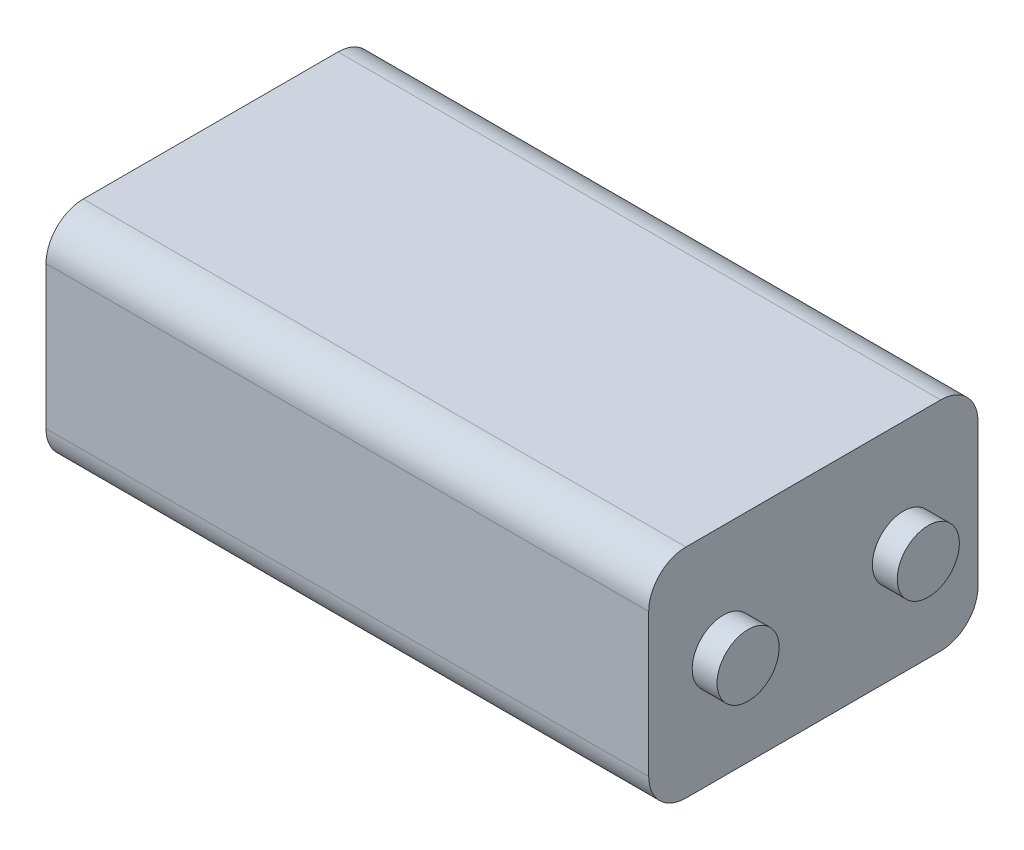
ISO-10303-21;
HEADER;
FILE_DESCRIPTION(('STEP AP214'),'2;1');
FILE_NAME('part.step','',(''),(''),'','','');
FILE_SCHEMA(('AUTOMOTIVE_DESIGN { 1 0 10303 214 1 1 1 1 }'));
ENDSEC;
DATA;
#1=APPLICATION_CONTEXT('core data for automotive mechanical design processes');
#2=APPLICATION_PROTOCOL_DEFINITION('international standard','automotive_design',2000,#1);
#3=PRODUCT_CONTEXT('',#1,'mechanical');
#4=PRODUCT('Part','Part','',(#3));
#5=PRODUCT_RELATED_PRODUCT_CATEGORY('part','',(#4));
#6=PRODUCT_DEFINITION_FORMATION('','',#4);
#7=PRODUCT_DEFINITION_CONTEXT('part definition',#1,'design');
#8=PRODUCT_DEFINITION('design','',#6,#7);
#9=PRODUCT_DEFINITION_SHAPE('','',#8);
#10=(LENGTH_UNIT() NAMED_UNIT(*) SI_UNIT(.MILLI.,.METRE.));
#11=(NAMED_UNIT(*) PLANE_ANGLE_UNIT() SI_UNIT($,.RADIAN.));
#12=(NAMED_UNIT(*) SI_UNIT($,.STERADIAN.) SOLID_ANGLE_UNIT());
#13=UNCERTAINTY_MEASURE_WITH_UNIT(LENGTH_MEASURE(1.E-05),#10,'distance_accuracy_value','');
#14=(GEOMETRIC_REPRESENTATION_CONTEXT(3) GLOBAL_UNCERTAINTY_ASSIGNED_CONTEXT((#13)) GLOBAL_UNIT_ASSIGNED_CONTEXT((#10,
#11,#12)) REPRESENTATION_CONTEXT('',''));
#15=CARTESIAN_POINT('',(0.,0.,0.));
#16=DIRECTION('',(0.,0.,1.));
#17=DIRECTION('',(1.,0.,0.));
#18=AXIS2_PLACEMENT_3D('',#15,#16,#17);
#19=CARTESIAN_POINT('',(24.25,8.75,26.5));
#20=DIRECTION('',(-1.,0.,0.));
#21=DIRECTION('',(0.,-1.,0.));
#22=AXIS2_PLACEMENT_3D('',#19,#20,#21);
#23=PLANE('',#22);
#24=CARTESIAN_POINT('',(24.25,0.,6.));
#25=DIRECTION('',(-1.,0.,0.));
#26=DIRECTION('',(0.,-1.,0.));
#27=AXIS2_PLACEMENT_3D('',#24,#25,#26);
#28=CIRCLE('',#27,2.5);
#29=CARTESIAN_POINT('',(24.25,-2.49999999999999,6.));
#30=VERTEX_POINT('',#29);
#31=EDGE_CURVE('E11',#30,#30,#28,.F.);
#32=ORIENTED_EDGE('',*,*,#31,.F.);
#33=EDGE_LOOP('',(#32));
#34=FACE_BOUND('',#33,.T.);
#35=CARTESIAN_POINT('',(24.25,0.,20.5));
#36=DIRECTION('',(-1.,0.,0.));
#37=DIRECTION('',(0.,-1.,0.));
#38=AXIS2_PLACEMENT_3D('',#35,#36,#37);
#39=CIRCLE('',#38,2.5);
#40=CARTESIAN_POINT('',(24.25,-2.49999999999999,20.5));
#41=VERTEX_POINT('',#40);
#42=EDGE_CURVE('E44',#41,#41,#39,.F.);
#43=ORIENTED_EDGE('',*,*,#42,.F.);
#44=EDGE_LOOP('',(#43));
#45=FACE_BOUND('',#44,.T.);
#46=DIRECTION('',(0.,1.,0.));
#47=VECTOR('',#46,1.);
#48=CARTESIAN_POINT('',(24.25,8.75,26.5));
#49=LINE('',#48,#47);
#50=CARTESIAN_POINT('',(24.25,-5.75000000000001,26.5));
#51=VERTEX_POINT('',#50);
#52=CARTESIAN_POINT('',(24.25,5.75,26.5));
#53=VERTEX_POINT('',#52);
#54=EDGE_CURVE('E121',#51,#53,#49,.T.);
#55=ORIENTED_EDGE('',*,*,#54,.F.);
#56=CARTESIAN_POINT('',(24.25,-5.75,23.5));
#57=DIRECTION('',(-1.,0.,0.));
#58=DIRECTION('',(0.,-1.,0.));
#59=AXIS2_PLACEMENT_3D('',#56,#57,#58);
#60=CIRCLE('',#59,3.);
#61=CARTESIAN_POINT('',(24.25,-8.75,23.5));
#62=VERTEX_POINT('',#61);
#63=EDGE_CURVE('E103',#51,#62,#60,.F.);
#64=ORIENTED_EDGE('',*,*,#63,.T.);
#65=DIRECTION('',(0.,0.,-1.));
#66=VECTOR('',#65,1.);
#67=CARTESIAN_POINT('',(24.25,-8.75,26.5));
#68=LINE('',#67,#66);
#69=CARTESIAN_POINT('',(24.25,-8.75,3.));
#70=VERTEX_POINT('',#69);
#71=EDGE_CURVE('E131',#62,#70,#68,.T.);
#72=ORIENTED_EDGE('',*,*,#71,.T.);
#73=CARTESIAN_POINT('',(24.25,-5.75,3.));
#74=DIRECTION('',(-1.,0.,0.));
#75=DIRECTION('',(0.,-1.,0.));
#76=AXIS2_PLACEMENT_3D('',#73,#74,#75);
#77=CIRCLE('',#76,3.);
#78=CARTESIAN_POINT('',(24.25,-5.75000000000001,0.));
#79=VERTEX_POINT('',#78);
#80=EDGE_CURVE('E114',#70,#79,#77,.F.);
#81=ORIENTED_EDGE('',*,*,#80,.T.);
#82=DIRECTION('',(0.,1.,0.));
#83=VECTOR('',#82,1.);
#84=CARTESIAN_POINT('',(24.25,8.75,0.));
#85=LINE('',#84,#83);
#86=CARTESIAN_POINT('',(24.25,5.75,0.));
#87=VERTEX_POINT('',#86);
#88=EDGE_CURVE('E134',#79,#87,#85,.T.);
#89=ORIENTED_EDGE('',*,*,#88,.T.);
#90=CARTESIAN_POINT('',(24.25,5.75,3.));
#91=DIRECTION('',(-1.,0.,0.));
#92=DIRECTION('',(0.,-1.,0.));
#93=AXIS2_PLACEMENT_3D('',#90,#91,#92);
#94=CIRCLE('',#93,3.);
#95=CARTESIAN_POINT('',(24.25,8.75,3.));
#96=VERTEX_POINT('',#95);
#97=EDGE_CURVE('E153',#87,#96,#94,.F.);
#98=ORIENTED_EDGE('',*,*,#97,.T.);
#99=DIRECTION('',(0.,0.,-1.));
#100=VECTOR('',#99,1.);
#101=CARTESIAN_POINT('',(24.25,8.75,26.5));
#102=LINE('',#101,#100);
#103=CARTESIAN_POINT('',(24.25,8.75,23.5));
#104=VERTEX_POINT('',#103);
#105=EDGE_CURVE('E148',#104,#96,#102,.T.);
#106=ORIENTED_EDGE('',*,*,#105,.F.);
#107=CARTESIAN_POINT('',(24.25,5.75,23.5));
#108=DIRECTION('',(-1.,0.,0.));
#109=DIRECTION('',(0.,-1.,0.));
#110=AXIS2_PLACEMENT_3D('',#107,#108,#109);
#111=CIRCLE('',#110,3.);
#112=EDGE_CURVE('E124',#104,#53,#111,.F.);
#113=ORIENTED_EDGE('',*,*,#112,.T.);
#114=EDGE_LOOP('',(#55,#64,#72,#81,#89,#98,#106,#113));
#115=FACE_BOUND('',#114,.T.);
#116=ADVANCED_FACE('F36',(#34,#45,#115),#23,.F.);
#117=CARTESIAN_POINT('',(-24.25,8.75,26.5));
#118=DIRECTION('',(0.,-1.,0.));
#119=DIRECTION('',(0.,0.,-1.));
#120=AXIS2_PLACEMENT_3D('',#117,#118,#119);
#121=PLANE('',#120);
#122=ORIENTED_EDGE('',*,*,#105,.T.);
#123=DIRECTION('',(-1.,0.,0.));
#124=VECTOR('',#123,1.);
#125=CARTESIAN_POINT('',(-24.25,8.75,3.));
#126=LINE('',#125,#124);
#127=CARTESIAN_POINT('',(-24.25,8.75,3.));
#128=VERTEX_POINT('',#127);
#129=EDGE_CURVE('E171',#96,#128,#126,.T.);
#130=ORIENTED_EDGE('',*,*,#129,.T.);
#131=DIRECTION('',(0.,0.,-1.));
#132=VECTOR('',#131,1.);
#133=CARTESIAN_POINT('',(-24.25,8.75,26.5));
#134=LINE('',#133,#132);
#135=CARTESIAN_POINT('',(-24.25,8.75,23.5));
#136=VERTEX_POINT('',#135);
#137=EDGE_CURVE('E146',#136,#128,#134,.T.);
#138=ORIENTED_EDGE('',*,*,#137,.F.);
#139=DIRECTION('',(-1.,0.,0.));
#140=VECTOR('',#139,1.);
#141=CARTESIAN_POINT('',(24.25,8.75,23.5));
#142=LINE('',#141,#140);
#143=EDGE_CURVE('E169',#136,#104,#142,.F.);
#144=ORIENTED_EDGE('',*,*,#143,.T.);
#145=EDGE_LOOP('',(#122,#130,#138,#144));
#146=FACE_BOUND('',#145,.T.);
#147=ADVANCED_FACE('F178',(#146),#121,.F.);
#148=CARTESIAN_POINT('',(-24.25,8.75,26.5));
#149=DIRECTION('',(1.,0.,0.));
#150=DIRECTION('',(0.,1.,0.));
#151=AXIS2_PLACEMENT_3D('',#148,#149,#150);
#152=PLANE('',#151);
#153=DIRECTION('',(0.,0.,-1.));
#154=VECTOR('',#153,1.);
#155=CARTESIAN_POINT('',(-24.25,-8.75,26.5));
#156=LINE('',#155,#154);
#157=CARTESIAN_POINT('',(-24.25,-8.75,23.5));
#158=VERTEX_POINT('',#157);
#159=CARTESIAN_POINT('',(-24.25,-8.75,3.));
#160=VERTEX_POINT('',#159);
#161=EDGE_CURVE('E143',#158,#160,#156,.T.);
#162=ORIENTED_EDGE('',*,*,#161,.F.);
#163=CARTESIAN_POINT('',(-24.25,-5.75,23.5));
#164=DIRECTION('',(1.,0.,0.));
#165=DIRECTION('',(0.,1.,0.));
#166=AXIS2_PLACEMENT_3D('',#163,#164,#165);
#167=CIRCLE('',#166,3.);
#168=CARTESIAN_POINT('',(-24.25,-5.75000000000001,26.5));
#169=VERTEX_POINT('',#168);
#170=EDGE_CURVE('E163',#158,#169,#167,.F.);
#171=ORIENTED_EDGE('',*,*,#170,.T.);
#172=DIRECTION('',(0.,-1.,0.));
#173=VECTOR('',#172,1.);
#174=CARTESIAN_POINT('',(-24.25,8.75,26.5));
#175=LINE('',#174,#173);
#176=CARTESIAN_POINT('',(-24.25,5.75,26.5));
#177=VERTEX_POINT('',#176);
#178=EDGE_CURVE('E123',#177,#169,#175,.T.);
#179=ORIENTED_EDGE('',*,*,#178,.F.);
#180=CARTESIAN_POINT('',(-24.25,5.75,23.5));
#181=DIRECTION('',(1.,0.,0.));
#182=DIRECTION('',(0.,1.,0.));
#183=AXIS2_PLACEMENT_3D('',#180,#181,#182);
#184=CIRCLE('',#183,3.);
#185=EDGE_CURVE('E59',#177,#136,#184,.F.);
#186=ORIENTED_EDGE('',*,*,#185,.T.);
#187=ORIENTED_EDGE('',*,*,#137,.T.);
#188=CARTESIAN_POINT('',(-24.25,5.75,3.));
#189=DIRECTION('',(1.,0.,0.));
#190=DIRECTION('',(0.,1.,0.));
#191=AXIS2_PLACEMENT_3D('',#188,#189,#190);
#192=CIRCLE('',#191,3.);
#193=CARTESIAN_POINT('',(-24.25,5.75,0.));
#194=VERTEX_POINT('',#193);
#195=EDGE_CURVE('E51',#128,#194,#192,.F.);
#196=ORIENTED_EDGE('',*,*,#195,.T.);
#197=DIRECTION('',(0.,-1.,0.));
#198=VECTOR('',#197,1.);
#199=CARTESIAN_POINT('',(-24.25,8.75,0.));
#200=LINE('',#199,#198);
#201=CARTESIAN_POINT('',(-24.25,-5.75000000000001,0.));
#202=VERTEX_POINT('',#201);
#203=EDGE_CURVE('E129',#194,#202,#200,.T.);
#204=ORIENTED_EDGE('',*,*,#203,.T.);
#205=CARTESIAN_POINT('',(-24.25,-5.75,3.));
#206=DIRECTION('',(1.,0.,0.));
#207=DIRECTION('',(0.,1.,0.));
#208=AXIS2_PLACEMENT_3D('',#205,#206,#207);
#209=CIRCLE('',#208,3.);
#210=EDGE_CURVE('E161',#202,#160,#209,.F.);
#211=ORIENTED_EDGE('',*,*,#210,.T.);
#212=EDGE_LOOP('',(#162,#171,#179,#186,#187,#196,#204,#211));
#213=FACE_BOUND('',#212,.T.);
#214=ADVANCED_FACE('F184',(#213),#152,.F.);
#215=CARTESIAN_POINT('',(-24.25,-8.75,26.5));
#216=DIRECTION('',(0.,1.,0.));
#217=DIRECTION('',(0.,0.,1.));
#218=AXIS2_PLACEMENT_3D('',#215,#216,#217);
#219=PLANE('',#218);
#220=ORIENTED_EDGE('',*,*,#71,.F.);
#221=DIRECTION('',(1.,0.,0.));
#222=VECTOR('',#221,1.);
#223=CARTESIAN_POINT('',(-24.25,-8.75,23.5));
#224=LINE('',#223,#222);
#225=EDGE_CURVE('E108',#62,#158,#224,.F.);
#226=ORIENTED_EDGE('',*,*,#225,.T.);
#227=ORIENTED_EDGE('',*,*,#161,.T.);
#228=DIRECTION('',(1.,0.,0.));
#229=VECTOR('',#228,1.);
#230=CARTESIAN_POINT('',(-24.25,-8.75,3.));
#231=LINE('',#230,#229);
#232=EDGE_CURVE('E113',#160,#70,#231,.T.);
#233=ORIENTED_EDGE('',*,*,#232,.T.);
#234=EDGE_LOOP('',(#220,#226,#227,#233));
#235=FACE_BOUND('',#234,.T.);
#236=ADVANCED_FACE('F209',(#235),#219,.F.);
#237=CARTESIAN_POINT('',(0.,0.,26.5));
#238=DIRECTION('',(0.,0.,1.));
#239=DIRECTION('',(1.,0.,0.));
#240=AXIS2_PLACEMENT_3D('',#237,#238,#239);
#241=PLANE('',#240);
#242=ORIENTED_EDGE('',*,*,#178,.T.);
#243=DIRECTION('',(1.,0.,0.));
#244=VECTOR('',#243,1.);
#245=CARTESIAN_POINT('',(24.25,-5.75,26.5));
#246=LINE('',#245,#244);
#247=EDGE_CURVE('E107',#169,#51,#246,.T.);
#248=ORIENTED_EDGE('',*,*,#247,.T.);
#249=ORIENTED_EDGE('',*,*,#54,.T.);
#250=DIRECTION('',(-1.,0.,0.));
#251=VECTOR('',#250,1.);
#252=CARTESIAN_POINT('',(-24.25,5.75,26.5));
#253=LINE('',#252,#251);
#254=EDGE_CURVE('E125',#53,#177,#253,.T.);
#255=ORIENTED_EDGE('',*,*,#254,.T.);
#256=EDGE_LOOP('',(#242,#248,#249,#255));
#257=FACE_BOUND('',#256,.T.);
#258=ADVANCED_FACE('F119',(#257),#241,.T.);
#259=CARTESIAN_POINT('',(0.,0.,0.));
#260=DIRECTION('',(0.,0.,1.));
#261=DIRECTION('',(1.,0.,0.));
#262=AXIS2_PLACEMENT_3D('',#259,#260,#261);
#263=PLANE('',#262);
#264=ORIENTED_EDGE('',*,*,#88,.F.);
#265=DIRECTION('',(1.,0.,0.));
#266=VECTOR('',#265,1.);
#267=CARTESIAN_POINT('',(0.,-5.75,0.));
#268=LINE('',#267,#266);
#269=EDGE_CURVE('E167',#79,#202,#268,.F.);
#270=ORIENTED_EDGE('',*,*,#269,.T.);
#271=ORIENTED_EDGE('',*,*,#203,.F.);
#272=DIRECTION('',(-1.,0.,0.));
#273=VECTOR('',#272,1.);
#274=CARTESIAN_POINT('',(0.,5.75,0.));
#275=LINE('',#274,#273);
#276=EDGE_CURVE('E165',#194,#87,#275,.F.);
#277=ORIENTED_EDGE('',*,*,#276,.T.);
#278=EDGE_LOOP('',(#264,#270,#271,#277));
#279=FACE_BOUND('',#278,.T.);
#280=ADVANCED_FACE('F193',(#279),#263,.F.);
#281=CARTESIAN_POINT('',(0.,-5.75,23.5));
#282=DIRECTION('',(-1.,0.,0.));
#283=DIRECTION('',(0.,0.,1.));
#284=AXIS2_PLACEMENT_3D('',#281,#282,#283);
#285=CYLINDRICAL_SURFACE('',#284,3.);
#286=ORIENTED_EDGE('',*,*,#170,.F.);
#287=ORIENTED_EDGE('',*,*,#225,.F.);
#288=ORIENTED_EDGE('',*,*,#63,.F.);
#289=ORIENTED_EDGE('',*,*,#247,.F.);
#290=EDGE_LOOP('',(#286,#287,#288,#289));
#291=FACE_BOUND('',#290,.T.);
#292=ADVANCED_FACE('F106',(#291),#285,.T.);
#293=CARTESIAN_POINT('',(-24.25,-5.75,3.));
#294=DIRECTION('',(1.,0.,0.));
#295=DIRECTION('',(0.,0.,-1.));
#296=AXIS2_PLACEMENT_3D('',#293,#294,#295);
#297=CYLINDRICAL_SURFACE('',#296,3.);
#298=ORIENTED_EDGE('',*,*,#210,.F.);
#299=ORIENTED_EDGE('',*,*,#269,.F.);
#300=ORIENTED_EDGE('',*,*,#80,.F.);
#301=ORIENTED_EDGE('',*,*,#232,.F.);
#302=EDGE_LOOP('',(#298,#299,#300,#301));
#303=FACE_BOUND('',#302,.T.);
#304=ADVANCED_FACE('F192',(#303),#297,.T.);
#305=CARTESIAN_POINT('',(-24.25,5.75,3.));
#306=DIRECTION('',(-1.,0.,0.));
#307=DIRECTION('',(0.,0.,1.));
#308=AXIS2_PLACEMENT_3D('',#305,#306,#307);
#309=CYLINDRICAL_SURFACE('',#308,3.);
#310=ORIENTED_EDGE('',*,*,#97,.F.);
#311=ORIENTED_EDGE('',*,*,#276,.F.);
#312=ORIENTED_EDGE('',*,*,#195,.F.);
#313=ORIENTED_EDGE('',*,*,#129,.F.);
#314=EDGE_LOOP('',(#310,#311,#312,#313));
#315=FACE_BOUND('',#314,.T.);
#316=ADVANCED_FACE('F195',(#315),#309,.T.);
#317=CARTESIAN_POINT('',(0.,5.75,23.5));
#318=DIRECTION('',(1.,0.,0.));
#319=DIRECTION('',(0.,0.,-1.));
#320=AXIS2_PLACEMENT_3D('',#317,#318,#319);
#321=CYLINDRICAL_SURFACE('',#320,3.);
#322=ORIENTED_EDGE('',*,*,#112,.F.);
#323=ORIENTED_EDGE('',*,*,#143,.F.);
#324=ORIENTED_EDGE('',*,*,#185,.F.);
#325=ORIENTED_EDGE('',*,*,#254,.F.);
#326=EDGE_LOOP('',(#322,#323,#324,#325));
#327=FACE_BOUND('',#326,.T.);
#328=ADVANCED_FACE('F38',(#327),#321,.T.);
#329=CARTESIAN_POINT('',(26.25,0.,20.5));
#330=DIRECTION('',(-1.,0.,0.));
#331=DIRECTION('',(0.,-1.,0.));
#332=AXIS2_PLACEMENT_3D('',#329,#330,#331);
#333=CYLINDRICAL_SURFACE('',#332,2.5);
#334=CARTESIAN_POINT('',(26.25,0.,20.5));
#335=DIRECTION('',(1.,0.,0.));
#336=DIRECTION('',(0.,1.,0.));
#337=AXIS2_PLACEMENT_3D('',#334,#335,#336);
#338=CIRCLE('',#337,2.5);
#339=CARTESIAN_POINT('',(26.25,2.50000000000001,20.5));
#340=VERTEX_POINT('',#339);
#341=EDGE_CURVE('E137',#340,#340,#338,.T.);
#342=ORIENTED_EDGE('',*,*,#341,.F.);
#343=EDGE_LOOP('',(#342));
#344=FACE_BOUND('',#343,.T.);
#345=ORIENTED_EDGE('',*,*,#42,.T.);
#346=EDGE_LOOP('',(#345));
#347=FACE_BOUND('',#346,.T.);
#348=ADVANCED_FACE('F175',(#344,#347),#333,.T.);
#349=CARTESIAN_POINT('',(26.25,0.,20.5));
#350=DIRECTION('',(1.,0.,0.));
#351=DIRECTION('',(0.,1.,0.));
#352=AXIS2_PLACEMENT_3D('',#349,#350,#351);
#353=PLANE('',#352);
#354=ORIENTED_EDGE('',*,*,#341,.T.);
#355=EDGE_LOOP('',(#354));
#356=FACE_BOUND('',#355,.T.);
#357=ADVANCED_FACE('F275',(#356),#353,.T.);
#358=CARTESIAN_POINT('',(26.25,0.,6.));
#359=DIRECTION('',(-1.,0.,0.));
#360=DIRECTION('',(0.,-1.,0.));
#361=AXIS2_PLACEMENT_3D('',#358,#359,#360);
#362=CYLINDRICAL_SURFACE('',#361,2.5);
#363=CARTESIAN_POINT('',(26.25,0.,6.));
#364=DIRECTION('',(1.,0.,0.));
#365=DIRECTION('',(0.,1.,0.));
#366=AXIS2_PLACEMENT_3D('',#363,#364,#365);
#367=CIRCLE('',#366,2.5);
#368=CARTESIAN_POINT('',(26.25,2.50000000000001,6.));
#369=VERTEX_POINT('',#368);
#370=EDGE_CURVE('E310',#369,#369,#367,.T.);
#371=ORIENTED_EDGE('',*,*,#370,.F.);
#372=EDGE_LOOP('',(#371));
#373=FACE_BOUND('',#372,.T.);
#374=ORIENTED_EDGE('',*,*,#31,.T.);
#375=EDGE_LOOP('',(#374));
#376=FACE_BOUND('',#375,.T.);
#377=ADVANCED_FACE('F284',(#373,#376),#362,.T.);
#378=CARTESIAN_POINT('',(26.25,0.,6.));
#379=DIRECTION('',(1.,0.,0.));
#380=DIRECTION('',(0.,1.,0.));
#381=AXIS2_PLACEMENT_3D('',#378,#379,#380);
#382=PLANE('',#381);
#383=ORIENTED_EDGE('',*,*,#370,.T.);
#384=EDGE_LOOP('',(#383));
#385=FACE_BOUND('',#384,.T.);
#386=ADVANCED_FACE('F294',(#385),#382,.T.);
#387=CLOSED_SHELL('',(#116,#147,#214,#236,#258,#280,#292,#304,#316,#328,#348,#357,#377,#386));
#388=MANIFOLD_SOLID_BREP('B2',#387);
#389=ADVANCED_BREP_SHAPE_REPRESENTATION('',(#18,#388),#14);
#390=SHAPE_DEFINITION_REPRESENTATION(#9,#389);
ENDSEC;
END-ISO-10303-21;
